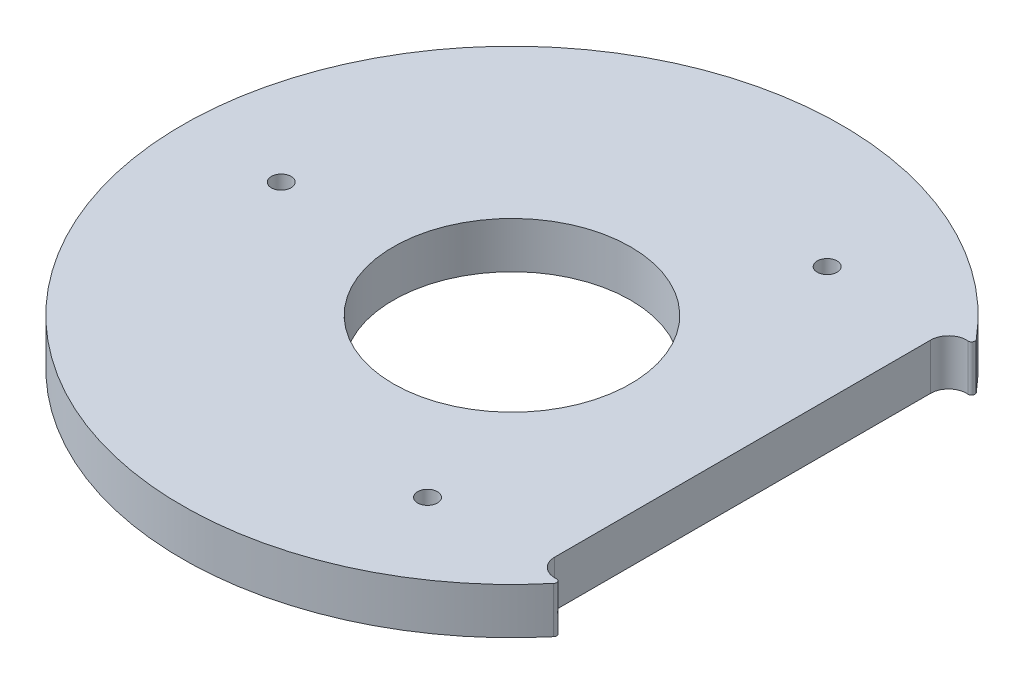
ISO-10303-21;
HEADER;
FILE_DESCRIPTION(('STEP AP214'),'2;1');
FILE_NAME('part.step','',(''),(''),'','','');
FILE_SCHEMA(('AUTOMOTIVE_DESIGN { 1 0 10303 214 1 1 1 1 }'));
ENDSEC;
DATA;
#1=APPLICATION_CONTEXT('core data for automotive mechanical design processes');
#2=APPLICATION_PROTOCOL_DEFINITION('international standard','automotive_design',2000,#1);
#3=PRODUCT_CONTEXT('',#1,'mechanical');
#4=PRODUCT('Part','Part','',(#3));
#5=PRODUCT_RELATED_PRODUCT_CATEGORY('part','',(#4));
#6=PRODUCT_DEFINITION_FORMATION('','',#4);
#7=PRODUCT_DEFINITION_CONTEXT('part definition',#1,'design');
#8=PRODUCT_DEFINITION('design','',#6,#7);
#9=PRODUCT_DEFINITION_SHAPE('','',#8);
#10=(LENGTH_UNIT() NAMED_UNIT(*) SI_UNIT(.MILLI.,.METRE.));
#11=(NAMED_UNIT(*) PLANE_ANGLE_UNIT() SI_UNIT($,.RADIAN.));
#12=(NAMED_UNIT(*) SI_UNIT($,.STERADIAN.) SOLID_ANGLE_UNIT());
#13=UNCERTAINTY_MEASURE_WITH_UNIT(LENGTH_MEASURE(1.E-05),#10,'distance_accuracy_value','');
#14=(GEOMETRIC_REPRESENTATION_CONTEXT(3) GLOBAL_UNCERTAINTY_ASSIGNED_CONTEXT((#13)) GLOBAL_UNIT_ASSIGNED_CONTEXT((#10,
#11,#12)) REPRESENTATION_CONTEXT('',''));
#15=CARTESIAN_POINT('',(0.,0.,0.));
#16=DIRECTION('',(0.,0.,1.));
#17=DIRECTION('',(1.,0.,0.));
#18=AXIS2_PLACEMENT_3D('',#15,#16,#17);
#19=CARTESIAN_POINT('',(0.,-3.5,0.));
#20=DIRECTION('',(0.,1.,0.));
#21=DIRECTION('',(0.,0.,1.));
#22=AXIS2_PLACEMENT_3D('',#19,#20,#21);
#23=PLANE('',#22);
#24=CARTESIAN_POINT('',(0.,-3.5,0.));
#25=DIRECTION('',(0.,1.,0.));
#26=DIRECTION('',(0.,0.,1.));
#27=AXIS2_PLACEMENT_3D('',#24,#25,#26);
#28=CIRCLE('',#27,18.);
#29=CARTESIAN_POINT('',(0.,-3.5,18.));
#30=VERTEX_POINT('',#29);
#31=EDGE_CURVE('E120',#30,#30,#28,.T.);
#32=ORIENTED_EDGE('',*,*,#31,.T.);
#33=EDGE_LOOP('',(#32));
#34=FACE_BOUND('',#33,.T.);
#35=CARTESIAN_POINT('',(37.9925630703769,-3.5,-31.7246079300356));
#36=DIRECTION('',(0.,1.,0.));
#37=DIRECTION('',(0.,0.,1.));
#38=AXIS2_PLACEMENT_3D('',#35,#36,#37);
#39=CIRCLE('',#38,0.503680975540726);
#40=CARTESIAN_POINT('',(37.9494092016024,-3.5,-31.2227790062663));
#41=VERTEX_POINT('',#40);
#42=CARTESIAN_POINT('',(38.3791803301599,-3.5,-32.0474416636503));
#43=VERTEX_POINT('',#42);
#44=EDGE_CURVE('E123',#41,#43,#39,.T.);
#45=ORIENTED_EDGE('',*,*,#44,.F.);
#46=CARTESIAN_POINT('',(37.7166544330073,-3.5,-28.5161138023531));
#47=DIRECTION('',(0.,1.,0.));
#48=DIRECTION('',(0.,0.,1.));
#49=AXIS2_PLACEMENT_3D('',#46,#47,#48);
#50=CIRCLE('',#49,2.71665443300733);
#51=CARTESIAN_POINT('',(35.,-3.5,-28.5161138023531));
#52=VERTEX_POINT('',#51);
#53=EDGE_CURVE('E135',#41,#52,#50,.T.);
#54=ORIENTED_EDGE('',*,*,#53,.T.);
#55=DIRECTION('',(0.,0.,-1.));
#56=VECTOR('',#55,1.);
#57=CARTESIAN_POINT('',(35.,-3.5,0.));
#58=LINE('',#57,#56);
#59=CARTESIAN_POINT('',(35.,-3.5,28.5161138023531));
#60=VERTEX_POINT('',#59);
#61=EDGE_CURVE('E133',#60,#52,#58,.T.);
#62=ORIENTED_EDGE('',*,*,#61,.F.);
#63=CARTESIAN_POINT('',(37.7166544330073,-3.5,28.5161138023531));
#64=DIRECTION('',(0.,1.,0.));
#65=DIRECTION('',(0.,0.,1.));
#66=AXIS2_PLACEMENT_3D('',#63,#64,#65);
#67=CIRCLE('',#66,2.71665443300733);
#68=CARTESIAN_POINT('',(37.9494092016024,-3.5,31.2227790062664));
#69=VERTEX_POINT('',#68);
#70=EDGE_CURVE('E109',#69,#60,#67,.F.);
#71=ORIENTED_EDGE('',*,*,#70,.F.);
#72=CARTESIAN_POINT('',(37.9925630703769,-3.5,31.7246079300356));
#73=DIRECTION('',(0.,1.,0.));
#74=DIRECTION('',(0.,0.,1.));
#75=AXIS2_PLACEMENT_3D('',#72,#73,#74);
#76=CIRCLE('',#75,0.503680975540726);
#77=CARTESIAN_POINT('',(38.3791803301599,-3.5,32.0474416636503));
#78=VERTEX_POINT('',#77);
#79=EDGE_CURVE('E129',#69,#78,#76,.F.);
#80=ORIENTED_EDGE('',*,*,#79,.T.);
#81=CARTESIAN_POINT('',(0.,-3.5,0.));
#82=DIRECTION('',(0.,1.,0.));
#83=DIRECTION('',(0.,0.,1.));
#84=AXIS2_PLACEMENT_3D('',#81,#82,#83);
#85=CIRCLE('',#84,50.);
#86=EDGE_CURVE('E126',#43,#78,#85,.T.);
#87=ORIENTED_EDGE('',*,*,#86,.F.);
#88=EDGE_LOOP('',(#45,#54,#62,#71,#80,#87));
#89=FACE_BOUND('',#88,.T.);
#90=CARTESIAN_POINT('',(-35.,-3.5,0.));
#91=DIRECTION('',(0.,1.,0.));
#92=DIRECTION('',(0.,0.,1.));
#93=AXIS2_PLACEMENT_3D('',#90,#91,#92);
#94=CIRCLE('',#93,4.);
#95=CARTESIAN_POINT('',(-35.,-3.5,4.));
#96=VERTEX_POINT('',#95);
#97=EDGE_CURVE('E146',#96,#96,#94,.F.);
#98=ORIENTED_EDGE('',*,*,#97,.F.);
#99=EDGE_LOOP('',(#98));
#100=FACE_BOUND('',#99,.T.);
#101=CARTESIAN_POINT('',(17.5,-3.5,30.3108891324554));
#102=DIRECTION('',(0.,1.,0.));
#103=DIRECTION('',(0.,0.,1.));
#104=AXIS2_PLACEMENT_3D('',#101,#102,#103);
#105=CIRCLE('',#104,4.);
#106=CARTESIAN_POINT('',(17.5,-3.5,34.3108891324554));
#107=VERTEX_POINT('',#106);
#108=EDGE_CURVE('E43',#107,#107,#105,.F.);
#109=ORIENTED_EDGE('',*,*,#108,.F.);
#110=EDGE_LOOP('',(#109));
#111=FACE_BOUND('',#110,.T.);
#112=CARTESIAN_POINT('',(17.5,-3.5,-30.3108891324554));
#113=DIRECTION('',(0.,1.,0.));
#114=DIRECTION('',(0.,0.,1.));
#115=AXIS2_PLACEMENT_3D('',#112,#113,#114);
#116=CIRCLE('',#115,4.);
#117=CARTESIAN_POINT('',(17.5,-3.5,-26.3108891324553));
#118=VERTEX_POINT('',#117);
#119=EDGE_CURVE('E11',#118,#118,#116,.F.);
#120=ORIENTED_EDGE('',*,*,#119,.F.);
#121=EDGE_LOOP('',(#120));
#122=FACE_BOUND('',#121,.T.);
#123=ADVANCED_FACE('F34',(#34,#89,#100,#111,#122),#23,.F.);
#124=CARTESIAN_POINT('',(17.5,-3.5,-30.3108891324554));
#125=DIRECTION('',(0.,-1.,0.));
#126=DIRECTION('',(0.,0.,-1.));
#127=AXIS2_PLACEMENT_3D('',#124,#125,#126);
#128=CIRCLE('',#127,3.);
#129=CARTESIAN_POINT('',(17.5,-3.5,-33.3108891324554));
#130=VERTEX_POINT('',#129);
#131=EDGE_CURVE('E286',#130,#130,#128,.T.);
#132=ORIENTED_EDGE('',*,*,#131,.T.);
#133=EDGE_LOOP('',(#132));
#134=FACE_BOUND('',#133,.T.);
#135=CARTESIAN_POINT('',(17.5,-3.5,-30.3108891324554));
#136=DIRECTION('',(0.,-1.,0.));
#137=DIRECTION('',(0.,0.,-1.));
#138=AXIS2_PLACEMENT_3D('',#135,#136,#137);
#139=CIRCLE('',#138,1.5);
#140=CARTESIAN_POINT('',(17.5,-3.5,-31.8108891324553));
#141=VERTEX_POINT('',#140);
#142=EDGE_CURVE('E250',#141,#141,#139,.T.);
#143=ORIENTED_EDGE('',*,*,#142,.F.);
#144=EDGE_LOOP('',(#143));
#145=FACE_BOUND('',#144,.T.);
#146=ADVANCED_FACE('F155',(#134,#145),#23,.F.);
#147=CARTESIAN_POINT('',(17.5,-3.5,30.3108891324554));
#148=DIRECTION('',(0.,-1.,0.));
#149=DIRECTION('',(0.,0.,-1.));
#150=AXIS2_PLACEMENT_3D('',#147,#148,#149);
#151=CIRCLE('',#150,2.99999999999999);
#152=CARTESIAN_POINT('',(17.5,-3.5,27.3108891324554));
#153=VERTEX_POINT('',#152);
#154=EDGE_CURVE('E277',#153,#153,#151,.T.);
#155=ORIENTED_EDGE('',*,*,#154,.T.);
#156=EDGE_LOOP('',(#155));
#157=FACE_BOUND('',#156,.T.);
#158=CARTESIAN_POINT('',(17.5,-3.5,30.3108891324554));
#159=DIRECTION('',(0.,-1.,0.));
#160=DIRECTION('',(0.,0.,-1.));
#161=AXIS2_PLACEMENT_3D('',#158,#159,#160);
#162=CIRCLE('',#161,1.5);
#163=CARTESIAN_POINT('',(17.5,-3.5,28.8108891324554));
#164=VERTEX_POINT('',#163);
#165=EDGE_CURVE('E256',#164,#164,#162,.T.);
#166=ORIENTED_EDGE('',*,*,#165,.F.);
#167=EDGE_LOOP('',(#166));
#168=FACE_BOUND('',#167,.T.);
#169=ADVANCED_FACE('F218',(#157,#168),#23,.F.);
#170=CARTESIAN_POINT('',(37.9925630703769,3.5,-31.7246079300356));
#171=DIRECTION('',(0.,-1.,0.));
#172=DIRECTION('',(0.,0.,-1.));
#173=AXIS2_PLACEMENT_3D('',#170,#171,#172);
#174=CYLINDRICAL_SURFACE('',#173,0.503680975540726);
#175=ORIENTED_EDGE('',*,*,#44,.T.);
#176=DIRECTION('',(0.,-1.,0.));
#177=VECTOR('',#176,1.);
#178=CARTESIAN_POINT('',(38.3791803301599,3.5,-32.0474416636503));
#179=LINE('',#178,#177);
#180=CARTESIAN_POINT('',(38.3791803301599,3.5,-32.0474416636503));
#181=VERTEX_POINT('',#180);
#182=EDGE_CURVE('E144',#181,#43,#179,.T.);
#183=ORIENTED_EDGE('',*,*,#182,.F.);
#184=CARTESIAN_POINT('',(37.9925630703769,3.5,-31.7246079300356));
#185=DIRECTION('',(0.,1.,0.));
#186=DIRECTION('',(0.,0.,1.));
#187=AXIS2_PLACEMENT_3D('',#184,#185,#186);
#188=CIRCLE('',#187,0.503680975540726);
#189=CARTESIAN_POINT('',(37.9494092016024,3.5,-31.2227790062663));
#190=VERTEX_POINT('',#189);
#191=EDGE_CURVE('E241',#190,#181,#188,.T.);
#192=ORIENTED_EDGE('',*,*,#191,.F.);
#193=DIRECTION('',(0.,-1.,0.));
#194=VECTOR('',#193,1.);
#195=CARTESIAN_POINT('',(37.9494092016024,3.5,-31.2227790062663));
#196=LINE('',#195,#194);
#197=EDGE_CURVE('E51',#190,#41,#196,.T.);
#198=ORIENTED_EDGE('',*,*,#197,.T.);
#199=EDGE_LOOP('',(#175,#183,#192,#198));
#200=FACE_BOUND('',#199,.T.);
#201=ADVANCED_FACE('F231',(#200),#174,.T.);
#202=CARTESIAN_POINT('',(0.,3.5,0.));
#203=DIRECTION('',(0.,-1.,0.));
#204=DIRECTION('',(0.,0.,-1.));
#205=AXIS2_PLACEMENT_3D('',#202,#203,#204);
#206=CYLINDRICAL_SURFACE('',#205,50.);
#207=ORIENTED_EDGE('',*,*,#86,.T.);
#208=DIRECTION('',(0.,-1.,0.));
#209=VECTOR('',#208,1.);
#210=CARTESIAN_POINT('',(38.3791803301599,3.5,32.0474416636503));
#211=LINE('',#210,#209);
#212=CARTESIAN_POINT('',(38.3791803301599,3.5,32.0474416636503));
#213=VERTEX_POINT('',#212);
#214=EDGE_CURVE('E142',#213,#78,#211,.T.);
#215=ORIENTED_EDGE('',*,*,#214,.F.);
#216=CARTESIAN_POINT('',(0.,3.5,0.));
#217=DIRECTION('',(0.,1.,0.));
#218=DIRECTION('',(0.,0.,1.));
#219=AXIS2_PLACEMENT_3D('',#216,#217,#218);
#220=CIRCLE('',#219,50.);
#221=EDGE_CURVE('E85',#181,#213,#220,.T.);
#222=ORIENTED_EDGE('',*,*,#221,.F.);
#223=ORIENTED_EDGE('',*,*,#182,.T.);
#224=EDGE_LOOP('',(#207,#215,#222,#223));
#225=FACE_BOUND('',#224,.T.);
#226=ADVANCED_FACE('F228',(#225),#206,.T.);
#227=CARTESIAN_POINT('',(37.9925630703769,3.5,31.7246079300356));
#228=DIRECTION('',(0.,-1.,0.));
#229=DIRECTION('',(0.,0.,-1.));
#230=AXIS2_PLACEMENT_3D('',#227,#228,#229);
#231=CYLINDRICAL_SURFACE('',#230,0.503680975540726);
#232=ORIENTED_EDGE('',*,*,#79,.F.);
#233=DIRECTION('',(0.,-1.,0.));
#234=VECTOR('',#233,1.);
#235=CARTESIAN_POINT('',(37.9494092016024,3.5,31.2227790062664));
#236=LINE('',#235,#234);
#237=CARTESIAN_POINT('',(37.9494092016024,3.5,31.2227790062664));
#238=VERTEX_POINT('',#237);
#239=EDGE_CURVE('E112',#238,#69,#236,.T.);
#240=ORIENTED_EDGE('',*,*,#239,.F.);
#241=CARTESIAN_POINT('',(37.9925630703769,3.5,31.7246079300356));
#242=DIRECTION('',(0.,1.,0.));
#243=DIRECTION('',(0.,0.,1.));
#244=AXIS2_PLACEMENT_3D('',#241,#242,#243);
#245=CIRCLE('',#244,0.503680975540726);
#246=EDGE_CURVE('E102',#238,#213,#245,.F.);
#247=ORIENTED_EDGE('',*,*,#246,.T.);
#248=ORIENTED_EDGE('',*,*,#214,.T.);
#249=EDGE_LOOP('',(#232,#240,#247,#248));
#250=FACE_BOUND('',#249,.T.);
#251=ADVANCED_FACE('F225',(#250),#231,.T.);
#252=CARTESIAN_POINT('',(37.7166544330073,3.5,28.5161138023531));
#253=DIRECTION('',(0.,-1.,0.));
#254=DIRECTION('',(0.,0.,-1.));
#255=AXIS2_PLACEMENT_3D('',#252,#253,#254);
#256=CYLINDRICAL_SURFACE('',#255,2.71665443300733);
#257=ORIENTED_EDGE('',*,*,#70,.T.);
#258=DIRECTION('',(0.,-1.,0.));
#259=VECTOR('',#258,1.);
#260=CARTESIAN_POINT('',(35.,3.5,28.5161138023531));
#261=LINE('',#260,#259);
#262=CARTESIAN_POINT('',(35.,3.5,28.5161138023531));
#263=VERTEX_POINT('',#262);
#264=EDGE_CURVE('E106',#263,#60,#261,.T.);
#265=ORIENTED_EDGE('',*,*,#264,.F.);
#266=CARTESIAN_POINT('',(37.7166544330073,3.5,28.5161138023531));
#267=DIRECTION('',(0.,1.,0.));
#268=DIRECTION('',(0.,0.,1.));
#269=AXIS2_PLACEMENT_3D('',#266,#267,#268);
#270=CIRCLE('',#269,2.71665443300733);
#271=EDGE_CURVE('E95',#238,#263,#270,.F.);
#272=ORIENTED_EDGE('',*,*,#271,.F.);
#273=ORIENTED_EDGE('',*,*,#239,.T.);
#274=EDGE_LOOP('',(#257,#265,#272,#273));
#275=FACE_BOUND('',#274,.T.);
#276=ADVANCED_FACE('F107',(#275),#256,.F.);
#277=CARTESIAN_POINT('',(35.,3.5,0.));
#278=DIRECTION('',(-1.,0.,0.));
#279=DIRECTION('',(0.,0.,1.));
#280=AXIS2_PLACEMENT_3D('',#277,#278,#279);
#281=PLANE('',#280);
#282=ORIENTED_EDGE('',*,*,#61,.T.);
#283=DIRECTION('',(0.,-1.,0.));
#284=VECTOR('',#283,1.);
#285=CARTESIAN_POINT('',(35.,3.5,-28.5161138023531));
#286=LINE('',#285,#284);
#287=CARTESIAN_POINT('',(35.,3.5,-28.5161138023531));
#288=VERTEX_POINT('',#287);
#289=EDGE_CURVE('E72',#288,#52,#286,.T.);
#290=ORIENTED_EDGE('',*,*,#289,.F.);
#291=DIRECTION('',(0.,0.,-1.));
#292=VECTOR('',#291,1.);
#293=CARTESIAN_POINT('',(35.,3.5,0.));
#294=LINE('',#293,#292);
#295=EDGE_CURVE('E100',#263,#288,#294,.T.);
#296=ORIENTED_EDGE('',*,*,#295,.F.);
#297=ORIENTED_EDGE('',*,*,#264,.T.);
#298=EDGE_LOOP('',(#282,#290,#296,#297));
#299=FACE_BOUND('',#298,.T.);
#300=ADVANCED_FACE('F114',(#299),#281,.F.);
#301=CARTESIAN_POINT('',(0.,3.5,0.));
#302=DIRECTION('',(0.,-1.,0.));
#303=DIRECTION('',(0.,0.,-1.));
#304=AXIS2_PLACEMENT_3D('',#301,#302,#303);
#305=CYLINDRICAL_SURFACE('',#304,18.);
#306=CARTESIAN_POINT('',(0.,3.5,0.));
#307=DIRECTION('',(0.,1.,0.));
#308=DIRECTION('',(0.,0.,1.));
#309=AXIS2_PLACEMENT_3D('',#306,#307,#308);
#310=CIRCLE('',#309,18.);
#311=CARTESIAN_POINT('',(0.,3.5,18.));
#312=VERTEX_POINT('',#311);
#313=EDGE_CURVE('E138',#312,#312,#310,.T.);
#314=ORIENTED_EDGE('',*,*,#313,.T.);
#315=EDGE_LOOP('',(#314));
#316=FACE_BOUND('',#315,.T.);
#317=ORIENTED_EDGE('',*,*,#31,.F.);
#318=EDGE_LOOP('',(#317));
#319=FACE_BOUND('',#318,.T.);
#320=ADVANCED_FACE('F36',(#316,#319),#305,.F.);
#321=CARTESIAN_POINT('',(37.7166544330073,3.5,-28.5161138023531));
#322=DIRECTION('',(0.,-1.,0.));
#323=DIRECTION('',(0.,0.,-1.));
#324=AXIS2_PLACEMENT_3D('',#321,#322,#323);
#325=CYLINDRICAL_SURFACE('',#324,2.71665443300733);
#326=ORIENTED_EDGE('',*,*,#53,.F.);
#327=ORIENTED_EDGE('',*,*,#197,.F.);
#328=CARTESIAN_POINT('',(37.7166544330073,3.5,-28.5161138023531));
#329=DIRECTION('',(0.,1.,0.));
#330=DIRECTION('',(0.,0.,1.));
#331=AXIS2_PLACEMENT_3D('',#328,#329,#330);
#332=CIRCLE('',#331,2.71665443300733);
#333=EDGE_CURVE('E115',#190,#288,#332,.T.);
#334=ORIENTED_EDGE('',*,*,#333,.T.);
#335=ORIENTED_EDGE('',*,*,#289,.T.);
#336=EDGE_LOOP('',(#326,#327,#334,#335));
#337=FACE_BOUND('',#336,.T.);
#338=ADVANCED_FACE('F213',(#337),#325,.F.);
#339=CARTESIAN_POINT('',(0.,3.5,0.));
#340=DIRECTION('',(0.,1.,0.));
#341=DIRECTION('',(0.,0.,1.));
#342=AXIS2_PLACEMENT_3D('',#339,#340,#341);
#343=PLANE('',#342);
#344=CARTESIAN_POINT('',(17.5,3.5,30.3108891324554));
#345=DIRECTION('',(0.,-1.,0.));
#346=DIRECTION('',(0.,0.,-1.));
#347=AXIS2_PLACEMENT_3D('',#344,#345,#346);
#348=CIRCLE('',#347,1.5);
#349=CARTESIAN_POINT('',(17.5,3.5,28.8108891324554));
#350=VERTEX_POINT('',#349);
#351=EDGE_CURVE('E259',#350,#350,#348,.T.);
#352=ORIENTED_EDGE('',*,*,#351,.T.);
#353=EDGE_LOOP('',(#352));
#354=FACE_BOUND('',#353,.T.);
#355=CARTESIAN_POINT('',(17.5,3.5,-30.3108891324554));
#356=DIRECTION('',(0.,-1.,0.));
#357=DIRECTION('',(0.,0.,-1.));
#358=AXIS2_PLACEMENT_3D('',#355,#356,#357);
#359=CIRCLE('',#358,1.5);
#360=CARTESIAN_POINT('',(17.5,3.5,-31.8108891324553));
#361=VERTEX_POINT('',#360);
#362=EDGE_CURVE('E253',#361,#361,#359,.T.);
#363=ORIENTED_EDGE('',*,*,#362,.T.);
#364=EDGE_LOOP('',(#363));
#365=FACE_BOUND('',#364,.T.);
#366=CARTESIAN_POINT('',(-35.,3.5,0.));
#367=DIRECTION('',(0.,-1.,0.));
#368=DIRECTION('',(0.,0.,-1.));
#369=AXIS2_PLACEMENT_3D('',#366,#367,#368);
#370=CIRCLE('',#369,1.5);
#371=CARTESIAN_POINT('',(-35.,3.5,-1.5));
#372=VERTEX_POINT('',#371);
#373=EDGE_CURVE('E124',#372,#372,#370,.T.);
#374=ORIENTED_EDGE('',*,*,#373,.T.);
#375=EDGE_LOOP('',(#374));
#376=FACE_BOUND('',#375,.T.);
#377=ORIENTED_EDGE('',*,*,#313,.F.);
#378=EDGE_LOOP('',(#377));
#379=FACE_BOUND('',#378,.T.);
#380=ORIENTED_EDGE('',*,*,#191,.T.);
#381=ORIENTED_EDGE('',*,*,#221,.T.);
#382=ORIENTED_EDGE('',*,*,#246,.F.);
#383=ORIENTED_EDGE('',*,*,#271,.T.);
#384=ORIENTED_EDGE('',*,*,#295,.T.);
#385=ORIENTED_EDGE('',*,*,#333,.F.);
#386=EDGE_LOOP('',(#380,#381,#382,#383,#384,#385));
#387=FACE_BOUND('',#386,.T.);
#388=ADVANCED_FACE('F97',(#354,#365,#376,#379,#387),#343,.T.);
#389=CARTESIAN_POINT('',(-35.,-3.5,0.));
#390=DIRECTION('',(0.,-1.,0.));
#391=DIRECTION('',(0.,0.,-1.));
#392=AXIS2_PLACEMENT_3D('',#389,#390,#391);
#393=CIRCLE('',#392,2.99999999999999);
#394=CARTESIAN_POINT('',(-35.,-3.5,-2.99999999999999));
#395=VERTEX_POINT('',#394);
#396=EDGE_CURVE('E268',#395,#395,#393,.T.);
#397=ORIENTED_EDGE('',*,*,#396,.T.);
#398=EDGE_LOOP('',(#397));
#399=FACE_BOUND('',#398,.T.);
#400=CARTESIAN_POINT('',(-35.,-3.5,0.));
#401=DIRECTION('',(0.,-1.,0.));
#402=DIRECTION('',(0.,0.,-1.));
#403=AXIS2_PLACEMENT_3D('',#400,#401,#402);
#404=CIRCLE('',#403,1.5);
#405=CARTESIAN_POINT('',(-35.,-3.5,-1.5));
#406=VERTEX_POINT('',#405);
#407=EDGE_CURVE('E247',#406,#406,#404,.T.);
#408=ORIENTED_EDGE('',*,*,#407,.F.);
#409=EDGE_LOOP('',(#408));
#410=FACE_BOUND('',#409,.T.);
#411=ADVANCED_FACE('F158',(#399,#410),#23,.F.);
#412=CARTESIAN_POINT('',(-35.,3.5,0.));
#413=DIRECTION('',(0.,-1.,0.));
#414=DIRECTION('',(0.,0.,-1.));
#415=AXIS2_PLACEMENT_3D('',#412,#413,#414);
#416=CYLINDRICAL_SURFACE('',#415,1.5);
#417=ORIENTED_EDGE('',*,*,#373,.F.);
#418=EDGE_LOOP('',(#417));
#419=FACE_BOUND('',#418,.T.);
#420=ORIENTED_EDGE('',*,*,#407,.T.);
#421=EDGE_LOOP('',(#420));
#422=FACE_BOUND('',#421,.T.);
#423=ADVANCED_FACE('F207',(#419,#422),#416,.F.);
#424=CARTESIAN_POINT('',(17.5,3.5,-30.3108891324554));
#425=DIRECTION('',(0.,-1.,0.));
#426=DIRECTION('',(0.,0.,-1.));
#427=AXIS2_PLACEMENT_3D('',#424,#425,#426);
#428=CYLINDRICAL_SURFACE('',#427,1.5);
#429=ORIENTED_EDGE('',*,*,#362,.F.);
#430=EDGE_LOOP('',(#429));
#431=FACE_BOUND('',#430,.T.);
#432=ORIENTED_EDGE('',*,*,#142,.T.);
#433=EDGE_LOOP('',(#432));
#434=FACE_BOUND('',#433,.T.);
#435=ADVANCED_FACE('F203',(#431,#434),#428,.F.);
#436=CARTESIAN_POINT('',(17.5,3.5,30.3108891324554));
#437=DIRECTION('',(0.,-1.,0.));
#438=DIRECTION('',(0.,0.,-1.));
#439=AXIS2_PLACEMENT_3D('',#436,#437,#438);
#440=CYLINDRICAL_SURFACE('',#439,1.5);
#441=ORIENTED_EDGE('',*,*,#351,.F.);
#442=EDGE_LOOP('',(#441));
#443=FACE_BOUND('',#442,.T.);
#444=ORIENTED_EDGE('',*,*,#165,.T.);
#445=EDGE_LOOP('',(#444));
#446=FACE_BOUND('',#445,.T.);
#447=ADVANCED_FACE('F196',(#443,#446),#440,.F.);
#448=CARTESIAN_POINT('',(-35.,-8.5,0.));
#449=DIRECTION('',(0.,-1.,0.));
#450=DIRECTION('',(0.,0.,-1.));
#451=AXIS2_PLACEMENT_3D('',#448,#449,#450);
#452=PLANE('',#451);
#453=CARTESIAN_POINT('',(-35.,-8.5,0.));
#454=DIRECTION('',(0.,-1.,0.));
#455=DIRECTION('',(0.,0.,-1.));
#456=AXIS2_PLACEMENT_3D('',#453,#454,#455);
#457=CIRCLE('',#456,4.);
#458=CARTESIAN_POINT('',(-35.,-8.5,-3.99999999999999));
#459=VERTEX_POINT('',#458);
#460=EDGE_CURVE('E262',#459,#459,#457,.T.);
#461=ORIENTED_EDGE('',*,*,#460,.T.);
#462=EDGE_LOOP('',(#461));
#463=FACE_BOUND('',#462,.T.);
#464=CARTESIAN_POINT('',(-35.,-8.5,0.));
#465=DIRECTION('',(0.,-1.,0.));
#466=DIRECTION('',(0.,0.,-1.));
#467=AXIS2_PLACEMENT_3D('',#464,#465,#466);
#468=CIRCLE('',#467,2.99999999999999);
#469=CARTESIAN_POINT('',(-35.,-8.5,-2.99999999999999));
#470=VERTEX_POINT('',#469);
#471=EDGE_CURVE('E267',#470,#470,#468,.T.);
#472=ORIENTED_EDGE('',*,*,#471,.F.);
#473=EDGE_LOOP('',(#472));
#474=FACE_BOUND('',#473,.T.);
#475=ADVANCED_FACE('F193',(#463,#474),#452,.T.);
#476=CARTESIAN_POINT('',(-35.,-8.5,0.));
#477=DIRECTION('',(0.,1.,0.));
#478=DIRECTION('',(0.,0.,1.));
#479=AXIS2_PLACEMENT_3D('',#476,#477,#478);
#480=CYLINDRICAL_SURFACE('',#479,4.);
#481=ORIENTED_EDGE('',*,*,#460,.F.);
#482=EDGE_LOOP('',(#481));
#483=FACE_BOUND('',#482,.T.);
#484=ORIENTED_EDGE('',*,*,#97,.T.);
#485=EDGE_LOOP('',(#484));
#486=FACE_BOUND('',#485,.T.);
#487=ADVANCED_FACE('F191',(#483,#486),#480,.T.);
#488=CARTESIAN_POINT('',(-35.,-8.5,0.));
#489=DIRECTION('',(0.,1.,0.));
#490=DIRECTION('',(0.,0.,1.));
#491=AXIS2_PLACEMENT_3D('',#488,#489,#490);
#492=CYLINDRICAL_SURFACE('',#491,2.99999999999999);
#493=ORIENTED_EDGE('',*,*,#471,.T.);
#494=EDGE_LOOP('',(#493));
#495=FACE_BOUND('',#494,.T.);
#496=ORIENTED_EDGE('',*,*,#396,.F.);
#497=EDGE_LOOP('',(#496));
#498=FACE_BOUND('',#497,.T.);
#499=ADVANCED_FACE('F184',(#495,#498),#492,.F.);
#500=CARTESIAN_POINT('',(17.5,-8.5,30.3108891324554));
#501=DIRECTION('',(0.,-1.,0.));
#502=DIRECTION('',(0.,0.,-1.));
#503=AXIS2_PLACEMENT_3D('',#500,#501,#502);
#504=PLANE('',#503);
#505=CARTESIAN_POINT('',(17.5,-8.5,30.3108891324554));
#506=DIRECTION('',(0.,-1.,0.));
#507=DIRECTION('',(0.,0.,-1.));
#508=AXIS2_PLACEMENT_3D('',#505,#506,#507);
#509=CIRCLE('',#508,4.);
#510=CARTESIAN_POINT('',(17.5,-8.5,26.3108891324554));
#511=VERTEX_POINT('',#510);
#512=EDGE_CURVE('E271',#511,#511,#509,.T.);
#513=ORIENTED_EDGE('',*,*,#512,.T.);
#514=EDGE_LOOP('',(#513));
#515=FACE_BOUND('',#514,.T.);
#516=CARTESIAN_POINT('',(17.5,-8.5,30.3108891324554));
#517=DIRECTION('',(0.,-1.,0.));
#518=DIRECTION('',(0.,0.,-1.));
#519=AXIS2_PLACEMENT_3D('',#516,#517,#518);
#520=CIRCLE('',#519,2.99999999999999);
#521=CARTESIAN_POINT('',(17.5,-8.5,27.3108891324554));
#522=VERTEX_POINT('',#521);
#523=EDGE_CURVE('E276',#522,#522,#520,.T.);
#524=ORIENTED_EDGE('',*,*,#523,.F.);
#525=EDGE_LOOP('',(#524));
#526=FACE_BOUND('',#525,.T.);
#527=ADVANCED_FACE('F181',(#515,#526),#504,.T.);
#528=CARTESIAN_POINT('',(17.5,-8.5,30.3108891324554));
#529=DIRECTION('',(0.,1.,0.));
#530=DIRECTION('',(0.,0.,1.));
#531=AXIS2_PLACEMENT_3D('',#528,#529,#530);
#532=CYLINDRICAL_SURFACE('',#531,4.);
#533=ORIENTED_EDGE('',*,*,#512,.F.);
#534=EDGE_LOOP('',(#533));
#535=FACE_BOUND('',#534,.T.);
#536=ORIENTED_EDGE('',*,*,#108,.T.);
#537=EDGE_LOOP('',(#536));
#538=FACE_BOUND('',#537,.T.);
#539=ADVANCED_FACE('F151',(#535,#538),#532,.T.);
#540=CARTESIAN_POINT('',(17.5,-8.5,30.3108891324554));
#541=DIRECTION('',(0.,1.,0.));
#542=DIRECTION('',(0.,0.,1.));
#543=AXIS2_PLACEMENT_3D('',#540,#541,#542);
#544=CYLINDRICAL_SURFACE('',#543,2.99999999999999);
#545=ORIENTED_EDGE('',*,*,#523,.T.);
#546=EDGE_LOOP('',(#545));
#547=FACE_BOUND('',#546,.T.);
#548=ORIENTED_EDGE('',*,*,#154,.F.);
#549=EDGE_LOOP('',(#548));
#550=FACE_BOUND('',#549,.T.);
#551=ADVANCED_FACE('F173',(#547,#550),#544,.F.);
#552=CARTESIAN_POINT('',(17.5,-8.5,-30.3108891324554));
#553=DIRECTION('',(0.,-1.,0.));
#554=DIRECTION('',(0.,0.,-1.));
#555=AXIS2_PLACEMENT_3D('',#552,#553,#554);
#556=PLANE('',#555);
#557=CARTESIAN_POINT('',(17.5,-8.5,-30.3108891324554));
#558=DIRECTION('',(0.,-1.,0.));
#559=DIRECTION('',(0.,0.,-1.));
#560=AXIS2_PLACEMENT_3D('',#557,#558,#559);
#561=CIRCLE('',#560,4.);
#562=CARTESIAN_POINT('',(17.5,-8.5,-34.3108891324554));
#563=VERTEX_POINT('',#562);
#564=EDGE_CURVE('E280',#563,#563,#561,.T.);
#565=ORIENTED_EDGE('',*,*,#564,.T.);
#566=EDGE_LOOP('',(#565));
#567=FACE_BOUND('',#566,.T.);
#568=CARTESIAN_POINT('',(17.5,-8.5,-30.3108891324554));
#569=DIRECTION('',(0.,-1.,0.));
#570=DIRECTION('',(0.,0.,-1.));
#571=AXIS2_PLACEMENT_3D('',#568,#569,#570);
#572=CIRCLE('',#571,3.);
#573=CARTESIAN_POINT('',(17.5,-8.5,-33.3108891324554));
#574=VERTEX_POINT('',#573);
#575=EDGE_CURVE('E285',#574,#574,#572,.T.);
#576=ORIENTED_EDGE('',*,*,#575,.F.);
#577=EDGE_LOOP('',(#576));
#578=FACE_BOUND('',#577,.T.);
#579=ADVANCED_FACE('F164',(#567,#578),#556,.T.);
#580=CARTESIAN_POINT('',(17.5,-8.5,-30.3108891324554));
#581=DIRECTION('',(0.,1.,0.));
#582=DIRECTION('',(0.,0.,1.));
#583=AXIS2_PLACEMENT_3D('',#580,#581,#582);
#584=CYLINDRICAL_SURFACE('',#583,4.);
#585=ORIENTED_EDGE('',*,*,#564,.F.);
#586=EDGE_LOOP('',(#585));
#587=FACE_BOUND('',#586,.T.);
#588=ORIENTED_EDGE('',*,*,#119,.T.);
#589=EDGE_LOOP('',(#588));
#590=FACE_BOUND('',#589,.T.);
#591=ADVANCED_FACE('F161',(#587,#590),#584,.T.);
#592=CARTESIAN_POINT('',(17.5,-8.5,-30.3108891324554));
#593=DIRECTION('',(0.,1.,0.));
#594=DIRECTION('',(0.,0.,1.));
#595=AXIS2_PLACEMENT_3D('',#592,#593,#594);
#596=CYLINDRICAL_SURFACE('',#595,3.);
#597=ORIENTED_EDGE('',*,*,#575,.T.);
#598=EDGE_LOOP('',(#597));
#599=FACE_BOUND('',#598,.T.);
#600=ORIENTED_EDGE('',*,*,#131,.F.);
#601=EDGE_LOOP('',(#600));
#602=FACE_BOUND('',#601,.T.);
#603=ADVANCED_FACE('F163',(#599,#602),#596,.F.);
#604=CLOSED_SHELL('',(#123,#146,#169,#201,#226,#251,#276,#300,#320,#338,#388,#411,#423,#435,
#447,#475,#487,#499,#527,#539,#551,#579,#591,#603));
#605=MANIFOLD_SOLID_BREP('B2',#604);
#606=ADVANCED_BREP_SHAPE_REPRESENTATION('',(#18,#605),#14);
#607=SHAPE_DEFINITION_REPRESENTATION(#9,#606);
ENDSEC;
END-ISO-10303-21;
